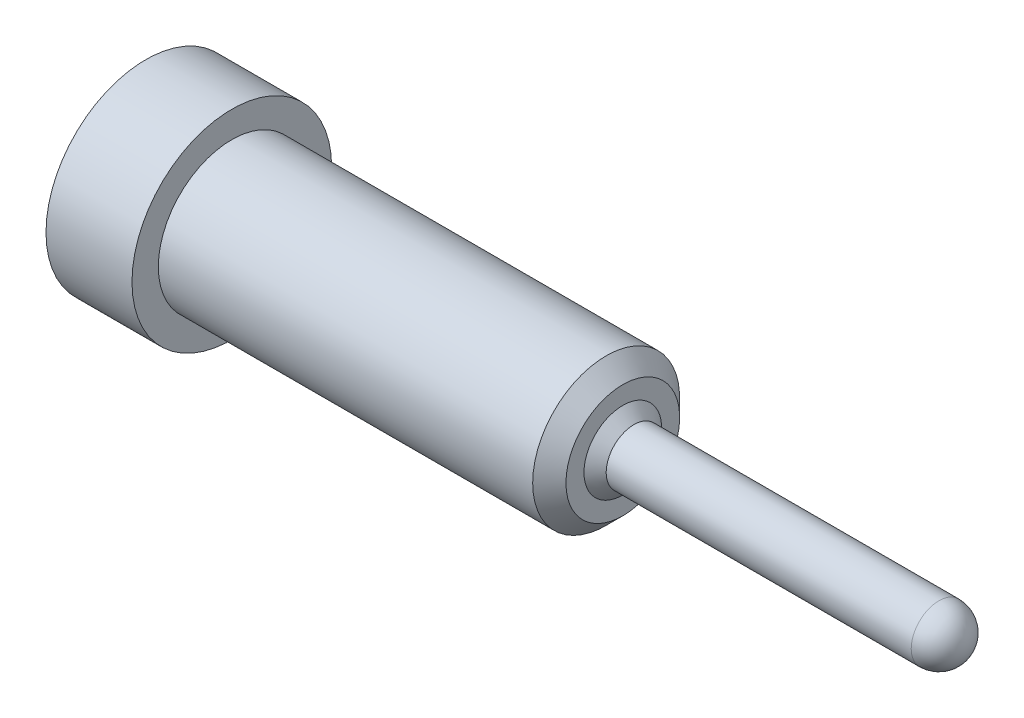
ISO-10303-21;
HEADER;
FILE_DESCRIPTION(('STEP AP214'),'2;1');
FILE_NAME('part.step','',(''),(''),'','','');
FILE_SCHEMA(('AUTOMOTIVE_DESIGN { 1 0 10303 214 1 1 1 1 }'));
ENDSEC;
DATA;
#1=APPLICATION_CONTEXT('core data for automotive mechanical design processes');
#2=APPLICATION_PROTOCOL_DEFINITION('international standard','automotive_design',2000,#1);
#3=PRODUCT_CONTEXT('',#1,'mechanical');
#4=PRODUCT('Part','Part','',(#3));
#5=PRODUCT_RELATED_PRODUCT_CATEGORY('part','',(#4));
#6=PRODUCT_DEFINITION_FORMATION('','',#4);
#7=PRODUCT_DEFINITION_CONTEXT('part definition',#1,'design');
#8=PRODUCT_DEFINITION('design','',#6,#7);
#9=PRODUCT_DEFINITION_SHAPE('','',#8);
#10=(LENGTH_UNIT() NAMED_UNIT(*) SI_UNIT(.MILLI.,.METRE.));
#11=(NAMED_UNIT(*) PLANE_ANGLE_UNIT() SI_UNIT($,.RADIAN.));
#12=(NAMED_UNIT(*) SI_UNIT($,.STERADIAN.) SOLID_ANGLE_UNIT());
#13=UNCERTAINTY_MEASURE_WITH_UNIT(LENGTH_MEASURE(1.E-05),#10,'distance_accuracy_value','');
#14=(GEOMETRIC_REPRESENTATION_CONTEXT(3) GLOBAL_UNCERTAINTY_ASSIGNED_CONTEXT((#13)) GLOBAL_UNIT_ASSIGNED_CONTEXT((#10,
#11,#12)) REPRESENTATION_CONTEXT('',''));
#15=CARTESIAN_POINT('',(0.,0.,0.));
#16=DIRECTION('',(0.,0.,1.));
#17=DIRECTION('',(1.,0.,0.));
#18=AXIS2_PLACEMENT_3D('',#15,#16,#17);
#19=CARTESIAN_POINT('',(0.,0.,0.));
#20=DIRECTION('',(1.,0.,0.));
#21=DIRECTION('',(0.,0.,-1.));
#22=AXIS2_PLACEMENT_3D('',#19,#20,#21);
#23=PLANE('',#22);
#24=CARTESIAN_POINT('',(0.,0.,0.));
#25=DIRECTION('',(-1.,0.,0.));
#26=DIRECTION('',(0.,0.,1.));
#27=AXIS2_PLACEMENT_3D('',#24,#25,#26);
#28=CIRCLE('',#27,0.7747);
#29=CARTESIAN_POINT('',(0.,0.,0.7747));
#30=VERTEX_POINT('',#29);
#31=EDGE_CURVE('E42',#30,#30,#28,.T.);
#32=ORIENTED_EDGE('',*,*,#31,.F.);
#33=EDGE_LOOP('',(#32));
#34=FACE_BOUND('',#33,.T.);
#35=CARTESIAN_POINT('',(0.,0.,0.));
#36=DIRECTION('',(-1.,0.,0.));
#37=DIRECTION('',(0.,0.,1.));
#38=AXIS2_PLACEMENT_3D('',#35,#36,#37);
#39=CIRCLE('',#38,0.914399999999954);
#40=CARTESIAN_POINT('',(0.,0.,0.914399999999954));
#41=VERTEX_POINT('',#40);
#42=EDGE_CURVE('E35',#41,#41,#39,.T.);
#43=ORIENTED_EDGE('',*,*,#42,.T.);
#44=EDGE_LOOP('',(#43));
#45=FACE_BOUND('',#44,.T.);
#46=ADVANCED_FACE('F16',(#34,#45),#23,.F.);
#47=CARTESIAN_POINT('',(7.26440000000012,0.,0.));
#48=DIRECTION('',(-1.,0.,0.));
#49=DIRECTION('',(0.,1.,0.));
#50=AXIS2_PLACEMENT_3D('',#47,#48,#49);
#51=SPHERICAL_SURFACE('',#50,0.254000000000004);
#52=CARTESIAN_POINT('',(7.26440000000012,0.,0.));
#53=DIRECTION('',(-1.,0.,0.));
#54=DIRECTION('',(0.,0.,1.));
#55=AXIS2_PLACEMENT_3D('',#52,#53,#54);
#56=CIRCLE('',#55,0.253999999999977);
#57=CARTESIAN_POINT('',(7.26440000000012,0.,0.253999999999977));
#58=VERTEX_POINT('',#57);
#59=EDGE_CURVE('E10',#58,#58,#56,.T.);
#60=ORIENTED_EDGE('',*,*,#59,.F.);
#61=EDGE_LOOP('',(#60));
#62=FACE_BOUND('',#61,.T.);
#63=ADVANCED_FACE('F67',(#62),#51,.T.);
#64=CARTESIAN_POINT('',(0.,0.,0.));
#65=DIRECTION('',(-1.,0.,0.));
#66=DIRECTION('',(0.,0.,1.));
#67=AXIS2_PLACEMENT_3D('',#64,#65,#66);
#68=CYLINDRICAL_SURFACE('',#67,0.253999999999977);
#69=CARTESIAN_POINT('',(4.47040000000008,0.,0.));
#70=DIRECTION('',(-1.,0.,0.));
#71=DIRECTION('',(0.,0.,1.));
#72=AXIS2_PLACEMENT_3D('',#69,#70,#71);
#73=CIRCLE('',#72,0.253999999999977);
#74=CARTESIAN_POINT('',(4.47040000000008,0.,0.253999999999977));
#75=VERTEX_POINT('',#74);
#76=EDGE_CURVE('E22',#75,#75,#73,.T.);
#77=ORIENTED_EDGE('',*,*,#76,.F.);
#78=EDGE_LOOP('',(#77));
#79=FACE_BOUND('',#78,.T.);
#80=ORIENTED_EDGE('',*,*,#59,.T.);
#81=EDGE_LOOP('',(#80));
#82=FACE_BOUND('',#81,.T.);
#83=ADVANCED_FACE('F64',(#79,#82),#68,.T.);
#84=CARTESIAN_POINT('',(4.47040000000008,0.,0.));
#85=DIRECTION('',(-1.,0.,0.));
#86=DIRECTION('',(0.,0.,1.));
#87=AXIS2_PLACEMENT_3D('',#84,#85,#86);
#88=CONICAL_SURFACE('',#87,0.253999999999977,0.785398163397357);
#89=CARTESIAN_POINT('',(4.3688,0.,0.));
#90=DIRECTION('',(-1.,0.,0.));
#91=DIRECTION('',(0.,0.,1.));
#92=AXIS2_PLACEMENT_3D('',#89,#90,#91);
#93=CIRCLE('',#92,0.355600000000035);
#94=CARTESIAN_POINT('',(4.3688,0.,0.355600000000035));
#95=VERTEX_POINT('',#94);
#96=EDGE_CURVE('E57',#95,#95,#93,.T.);
#97=ORIENTED_EDGE('',*,*,#96,.F.);
#98=EDGE_LOOP('',(#97));
#99=FACE_BOUND('',#98,.T.);
#100=ORIENTED_EDGE('',*,*,#76,.T.);
#101=EDGE_LOOP('',(#100));
#102=FACE_BOUND('',#101,.T.);
#103=ADVANCED_FACE('F62',(#99,#102),#88,.T.);
#104=CARTESIAN_POINT('',(4.3688,0.520699999999999,0.));
#105=DIRECTION('',(-1.,0.,0.));
#106=DIRECTION('',(0.,0.,1.));
#107=AXIS2_PLACEMENT_3D('',#104,#105,#106);
#108=PLANE('',#107);
#109=CARTESIAN_POINT('',(4.3688,0.,0.));
#110=DIRECTION('',(-1.,0.,0.));
#111=DIRECTION('',(0.,0.,1.));
#112=AXIS2_PLACEMENT_3D('',#109,#110,#111);
#113=CIRCLE('',#112,0.520699999999999);
#114=CARTESIAN_POINT('',(4.3688,0.,0.520699999999999));
#115=VERTEX_POINT('',#114);
#116=EDGE_CURVE('E54',#115,#115,#113,.T.);
#117=ORIENTED_EDGE('',*,*,#116,.F.);
#118=EDGE_LOOP('',(#117));
#119=FACE_BOUND('',#118,.T.);
#120=ORIENTED_EDGE('',*,*,#96,.T.);
#121=EDGE_LOOP('',(#120));
#122=FACE_BOUND('',#121,.T.);
#123=ADVANCED_FACE('F81',(#119,#122),#108,.F.);
#124=CARTESIAN_POINT('',(4.3688,0.,0.));
#125=DIRECTION('',(-1.,0.,0.));
#126=DIRECTION('',(0.,0.,1.));
#127=AXIS2_PLACEMENT_3D('',#124,#125,#126);
#128=CONICAL_SURFACE('',#127,0.520699999999999,0.785398163397357);
#129=CARTESIAN_POINT('',(4.21639999999999,0.,0.));
#130=DIRECTION('',(-1.,0.,0.));
#131=DIRECTION('',(0.,0.,1.));
#132=AXIS2_PLACEMENT_3D('',#129,#130,#131);
#133=CIRCLE('',#132,0.673099999999982);
#134=CARTESIAN_POINT('',(4.21639999999999,0.,0.673099999999982));
#135=VERTEX_POINT('',#134);
#136=EDGE_CURVE('E51',#135,#135,#133,.T.);
#137=ORIENTED_EDGE('',*,*,#136,.F.);
#138=EDGE_LOOP('',(#137));
#139=FACE_BOUND('',#138,.T.);
#140=ORIENTED_EDGE('',*,*,#116,.T.);
#141=EDGE_LOOP('',(#140));
#142=FACE_BOUND('',#141,.T.);
#143=ADVANCED_FACE('F85',(#139,#142),#128,.T.);
#144=CARTESIAN_POINT('',(0.,0.,0.));
#145=DIRECTION('',(-1.,0.,0.));
#146=DIRECTION('',(0.,0.,1.));
#147=AXIS2_PLACEMENT_3D('',#144,#145,#146);
#148=CYLINDRICAL_SURFACE('',#147,0.673099999999982);
#149=CARTESIAN_POINT('',(0.787400000000021,0.,0.));
#150=DIRECTION('',(-1.,0.,0.));
#151=DIRECTION('',(0.,0.,1.));
#152=AXIS2_PLACEMENT_3D('',#149,#150,#151);
#153=CIRCLE('',#152,0.673099999999982);
#154=CARTESIAN_POINT('',(0.787400000000021,0.,0.673099999999982));
#155=VERTEX_POINT('',#154);
#156=EDGE_CURVE('E48',#155,#155,#153,.T.);
#157=ORIENTED_EDGE('',*,*,#156,.F.);
#158=EDGE_LOOP('',(#157));
#159=FACE_BOUND('',#158,.T.);
#160=ORIENTED_EDGE('',*,*,#136,.T.);
#161=EDGE_LOOP('',(#160));
#162=FACE_BOUND('',#161,.T.);
#163=ADVANCED_FACE('F89',(#159,#162),#148,.T.);
#164=CARTESIAN_POINT('',(0.787400000000021,0.914399999999954,0.));
#165=DIRECTION('',(-1.,0.,0.));
#166=DIRECTION('',(0.,0.,1.));
#167=AXIS2_PLACEMENT_3D('',#164,#165,#166);
#168=PLANE('',#167);
#169=CARTESIAN_POINT('',(0.787400000000021,0.,0.));
#170=DIRECTION('',(-1.,0.,0.));
#171=DIRECTION('',(0.,0.,1.));
#172=AXIS2_PLACEMENT_3D('',#169,#170,#171);
#173=CIRCLE('',#172,0.914399999999954);
#174=CARTESIAN_POINT('',(0.787400000000021,0.,0.914399999999954));
#175=VERTEX_POINT('',#174);
#176=EDGE_CURVE('E39',#175,#175,#173,.T.);
#177=ORIENTED_EDGE('',*,*,#176,.F.);
#178=EDGE_LOOP('',(#177));
#179=FACE_BOUND('',#178,.T.);
#180=ORIENTED_EDGE('',*,*,#156,.T.);
#181=EDGE_LOOP('',(#180));
#182=FACE_BOUND('',#181,.T.);
#183=ADVANCED_FACE('F93',(#179,#182),#168,.F.);
#184=CARTESIAN_POINT('',(0.,0.,0.));
#185=DIRECTION('',(-1.,0.,0.));
#186=DIRECTION('',(0.,0.,1.));
#187=AXIS2_PLACEMENT_3D('',#184,#185,#186);
#188=CYLINDRICAL_SURFACE('',#187,0.914399999999954);
#189=ORIENTED_EDGE('',*,*,#42,.F.);
#190=EDGE_LOOP('',(#189));
#191=FACE_BOUND('',#190,.T.);
#192=ORIENTED_EDGE('',*,*,#176,.T.);
#193=EDGE_LOOP('',(#192));
#194=FACE_BOUND('',#193,.T.);
#195=ADVANCED_FACE('F29',(#191,#194),#188,.T.);
#196=CARTESIAN_POINT('',(3.80999999999999,0.,0.));
#197=DIRECTION('',(-1.,0.,0.));
#198=DIRECTION('',(0.,0.,1.));
#199=AXIS2_PLACEMENT_3D('',#196,#197,#198);
#200=CONICAL_SURFACE('',#199,0.546100000000001,1.02974425867665);
#201=CARTESIAN_POINT('',(4.13812998405095,0.,0.));
#202=VERTEX_POINT('',#201);
#203=VERTEX_LOOP('',#202);
#204=FACE_BOUND('',#203,.T.);
#205=CARTESIAN_POINT('',(3.80999999999999,0.,0.));
#206=DIRECTION('',(-1.,0.,0.));
#207=DIRECTION('',(0.,0.,1.));
#208=AXIS2_PLACEMENT_3D('',#205,#206,#207);
#209=CIRCLE('',#208,0.546100000000001);
#210=CARTESIAN_POINT('',(3.80999999999999,0.,0.546100000000001));
#211=VERTEX_POINT('',#210);
#212=EDGE_CURVE('E33',#211,#211,#209,.T.);
#213=ORIENTED_EDGE('',*,*,#212,.T.);
#214=EDGE_LOOP('',(#213));
#215=FACE_BOUND('',#214,.T.);
#216=ADVANCED_FACE('F25',(#204,#215),#200,.F.);
#217=CARTESIAN_POINT('',(0.,0.,0.));
#218=DIRECTION('',(-1.,0.,0.));
#219=DIRECTION('',(0.,0.,1.));
#220=AXIS2_PLACEMENT_3D('',#217,#218,#219);
#221=CYLINDRICAL_SURFACE('',#220,0.546100000000001);
#222=ORIENTED_EDGE('',*,*,#212,.F.);
#223=EDGE_LOOP('',(#222));
#224=FACE_BOUND('',#223,.T.);
#225=CARTESIAN_POINT('',(0.395946814610231,0.,0.));
#226=DIRECTION('',(-1.,0.,0.));
#227=DIRECTION('',(0.,0.,1.));
#228=AXIS2_PLACEMENT_3D('',#225,#226,#227);
#229=CIRCLE('',#228,0.546100000000001);
#230=CARTESIAN_POINT('',(0.395946814610231,0.,0.546100000000001));
#231=VERTEX_POINT('',#230);
#232=EDGE_CURVE('E36',#231,#231,#229,.T.);
#233=ORIENTED_EDGE('',*,*,#232,.T.);
#234=EDGE_LOOP('',(#233));
#235=FACE_BOUND('',#234,.T.);
#236=ADVANCED_FACE('F28',(#224,#235),#221,.F.);
#237=CARTESIAN_POINT('',(0.,0.,0.));
#238=DIRECTION('',(-1.,0.,0.));
#239=DIRECTION('',(0.,0.,1.));
#240=AXIS2_PLACEMENT_3D('',#237,#238,#239);
#241=CONICAL_SURFACE('',#240,0.7747,0.52359877559831);
#242=ORIENTED_EDGE('',*,*,#232,.F.);
#243=EDGE_LOOP('',(#242));
#244=FACE_BOUND('',#243,.T.);
#245=ORIENTED_EDGE('',*,*,#31,.T.);
#246=EDGE_LOOP('',(#245));
#247=FACE_BOUND('',#246,.T.);
#248=ADVANCED_FACE('F103',(#244,#247),#241,.F.);
#249=CLOSED_SHELL('',(#46,#63,#83,#103,#123,#143,#163,#183,#195,#216,#236,#248));
#250=MANIFOLD_SOLID_BREP('B1',#249);
#251=ADVANCED_BREP_SHAPE_REPRESENTATION('',(#18,#250),#14);
#252=SHAPE_DEFINITION_REPRESENTATION(#9,#251);
ENDSEC;
END-ISO-10303-21;
